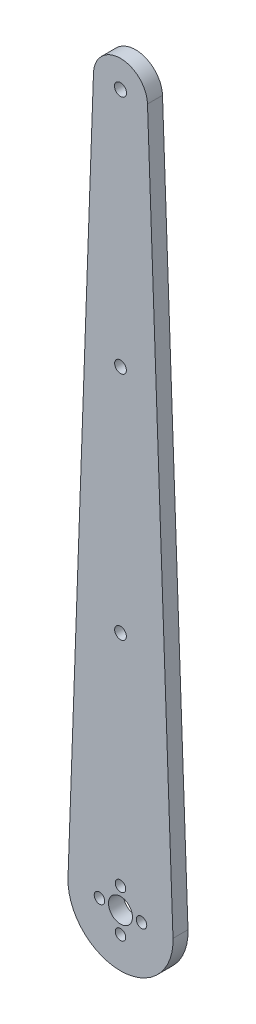
ISO-10303-21;
HEADER;
FILE_DESCRIPTION(('STEP AP214'),'2;1');
FILE_NAME('part.step','',(''),(''),'','','');
FILE_SCHEMA(('AUTOMOTIVE_DESIGN { 1 0 10303 214 1 1 1 1 }'));
ENDSEC;
DATA;
#1=APPLICATION_CONTEXT('core data for automotive mechanical design processes');
#2=APPLICATION_PROTOCOL_DEFINITION('international standard','automotive_design',2000,#1);
#3=PRODUCT_CONTEXT('',#1,'mechanical');
#4=PRODUCT('Part','Part','',(#3));
#5=PRODUCT_RELATED_PRODUCT_CATEGORY('part','',(#4));
#6=PRODUCT_DEFINITION_FORMATION('','',#4);
#7=PRODUCT_DEFINITION_CONTEXT('part definition',#1,'design');
#8=PRODUCT_DEFINITION('design','',#6,#7);
#9=PRODUCT_DEFINITION_SHAPE('','',#8);
#10=(LENGTH_UNIT() NAMED_UNIT(*) SI_UNIT(.MILLI.,.METRE.));
#11=(NAMED_UNIT(*) PLANE_ANGLE_UNIT() SI_UNIT($,.RADIAN.));
#12=(NAMED_UNIT(*) SI_UNIT($,.STERADIAN.) SOLID_ANGLE_UNIT());
#13=UNCERTAINTY_MEASURE_WITH_UNIT(LENGTH_MEASURE(1.E-05),#10,'distance_accuracy_value','');
#14=(GEOMETRIC_REPRESENTATION_CONTEXT(3) GLOBAL_UNCERTAINTY_ASSIGNED_CONTEXT((#13)) GLOBAL_UNIT_ASSIGNED_CONTEXT((#10,
#11,#12)) REPRESENTATION_CONTEXT('',''));
#15=CARTESIAN_POINT('',(0.,0.,0.));
#16=DIRECTION('',(0.,0.,1.));
#17=DIRECTION('',(1.,0.,0.));
#18=AXIS2_PLACEMENT_3D('',#15,#16,#17);
#19=CARTESIAN_POINT('',(0.,236.8,-5.));
#20=DIRECTION('',(0.,0.,1.));
#21=DIRECTION('',(1.,0.,0.));
#22=AXIS2_PLACEMENT_3D('',#19,#20,#21);
#23=CYLINDRICAL_SURFACE('',#22,9.00000000000001);
#24=CARTESIAN_POINT('',(0.,236.8,0.));
#25=DIRECTION('',(0.,0.,1.));
#26=DIRECTION('',(1.,0.,0.));
#27=AXIS2_PLACEMENT_3D('',#24,#25,#26);
#28=CIRCLE('',#27,9.00000000000001);
#29=CARTESIAN_POINT('',(8.99420001419527,237.123057432432,0.));
#30=VERTEX_POINT('',#29);
#31=CARTESIAN_POINT('',(-8.99420001419527,237.123057432432,0.));
#32=VERTEX_POINT('',#31);
#33=EDGE_CURVE('E98',#30,#32,#28,.T.);
#34=ORIENTED_EDGE('',*,*,#33,.F.);
#35=DIRECTION('',(0.,0.,1.));
#36=VECTOR('',#35,1.);
#37=CARTESIAN_POINT('',(8.99420001419527,237.123057432432,-5.));
#38=LINE('',#37,#36);
#39=CARTESIAN_POINT('',(8.99420001419527,237.123057432432,-5.));
#40=VERTEX_POINT('',#39);
#41=EDGE_CURVE('E11',#40,#30,#38,.T.);
#42=ORIENTED_EDGE('',*,*,#41,.F.);
#43=CARTESIAN_POINT('',(0.,236.8,-5.));
#44=DIRECTION('',(0.,0.,1.));
#45=DIRECTION('',(1.,0.,0.));
#46=AXIS2_PLACEMENT_3D('',#43,#44,#45);
#47=CIRCLE('',#46,9.00000000000001);
#48=CARTESIAN_POINT('',(-8.99420001419527,237.123057432432,-5.));
#49=VERTEX_POINT('',#48);
#50=EDGE_CURVE('E91',#40,#49,#47,.T.);
#51=ORIENTED_EDGE('',*,*,#50,.T.);
#52=DIRECTION('',(0.,0.,1.));
#53=VECTOR('',#52,1.);
#54=CARTESIAN_POINT('',(-8.99420001419527,237.123057432432,-5.));
#55=LINE('',#54,#53);
#56=EDGE_CURVE('E36',#49,#32,#55,.T.);
#57=ORIENTED_EDGE('',*,*,#56,.T.);
#58=EDGE_LOOP('',(#34,#42,#51,#57));
#59=FACE_BOUND('',#58,.T.);
#60=ADVANCED_FACE('F33',(#59),#23,.T.);
#61=CARTESIAN_POINT('',(8.99420001419527,237.123057432432,-5.));
#62=DIRECTION('',(0.999355557132808,0.0358952702702703,0.));
#63=DIRECTION('',(-0.0358952702702703,0.999355557132808,0.));
#64=AXIS2_PLACEMENT_3D('',#61,#62,#63);
#65=PLANE('',#64);
#66=DIRECTION('',(-0.0358952702702703,0.999355557132807,0.));
#67=VECTOR('',#66,1.);
#68=CARTESIAN_POINT('',(8.99420001419527,237.123057432432,0.));
#69=LINE('',#68,#67);
#70=CARTESIAN_POINT('',(17.4887222498241,0.62816722972973,0.));
#71=VERTEX_POINT('',#70);
#72=EDGE_CURVE('E93',#71,#30,#69,.T.);
#73=ORIENTED_EDGE('',*,*,#72,.F.);
#74=DIRECTION('',(0.,0.,1.));
#75=VECTOR('',#74,1.);
#76=CARTESIAN_POINT('',(17.4887222498241,0.62816722972973,-5.));
#77=LINE('',#76,#75);
#78=CARTESIAN_POINT('',(17.4887222498241,0.62816722972973,-5.));
#79=VERTEX_POINT('',#78);
#80=EDGE_CURVE('E42',#79,#71,#77,.T.);
#81=ORIENTED_EDGE('',*,*,#80,.F.);
#82=DIRECTION('',(-0.0358952702702703,0.999355557132807,0.));
#83=VECTOR('',#82,1.);
#84=CARTESIAN_POINT('',(8.99420001419527,237.123057432432,-5.));
#85=LINE('',#84,#83);
#86=EDGE_CURVE('E88',#79,#40,#85,.T.);
#87=ORIENTED_EDGE('',*,*,#86,.T.);
#88=ORIENTED_EDGE('',*,*,#41,.T.);
#89=EDGE_LOOP('',(#73,#81,#87,#88));
#90=FACE_BOUND('',#89,.T.);
#91=ADVANCED_FACE('F109',(#90),#65,.T.);
#92=CARTESIAN_POINT('',(0.,0.,-5.));
#93=DIRECTION('',(0.,0.,1.));
#94=DIRECTION('',(1.,0.,0.));
#95=AXIS2_PLACEMENT_3D('',#92,#93,#94);
#96=CYLINDRICAL_SURFACE('',#95,17.5);
#97=CARTESIAN_POINT('',(0.,0.,0.));
#98=DIRECTION('',(0.,0.,1.));
#99=DIRECTION('',(1.,0.,0.));
#100=AXIS2_PLACEMENT_3D('',#97,#98,#99);
#101=CIRCLE('',#100,17.5);
#102=CARTESIAN_POINT('',(-17.4887222498241,0.628167229729727,0.));
#103=VERTEX_POINT('',#102);
#104=EDGE_CURVE('E83',#103,#71,#101,.T.);
#105=ORIENTED_EDGE('',*,*,#104,.F.);
#106=DIRECTION('',(0.,0.,1.));
#107=VECTOR('',#106,1.);
#108=CARTESIAN_POINT('',(-17.4887222498241,0.628167229729727,-5.));
#109=LINE('',#108,#107);
#110=CARTESIAN_POINT('',(-17.4887222498241,0.628167229729727,-5.));
#111=VERTEX_POINT('',#110);
#112=EDGE_CURVE('E78',#111,#103,#109,.T.);
#113=ORIENTED_EDGE('',*,*,#112,.F.);
#114=CARTESIAN_POINT('',(0.,0.,-5.));
#115=DIRECTION('',(0.,0.,1.));
#116=DIRECTION('',(1.,0.,0.));
#117=AXIS2_PLACEMENT_3D('',#114,#115,#116);
#118=CIRCLE('',#117,17.5);
#119=EDGE_CURVE('E81',#111,#79,#118,.T.);
#120=ORIENTED_EDGE('',*,*,#119,.T.);
#121=ORIENTED_EDGE('',*,*,#80,.T.);
#122=EDGE_LOOP('',(#105,#113,#120,#121));
#123=FACE_BOUND('',#122,.T.);
#124=ADVANCED_FACE('F80',(#123),#96,.T.);
#125=CARTESIAN_POINT('',(-8.99420001419527,237.123057432432,-5.));
#126=DIRECTION('',(-0.999355557132808,0.0358952702702703,0.));
#127=DIRECTION('',(-0.0358952702702703,-0.999355557132808,0.));
#128=AXIS2_PLACEMENT_3D('',#125,#126,#127);
#129=PLANE('',#128);
#130=DIRECTION('',(-0.0358952702702703,-0.999355557132807,0.));
#131=VECTOR('',#130,1.);
#132=CARTESIAN_POINT('',(-8.99420001419527,237.123057432432,0.));
#133=LINE('',#132,#131);
#134=EDGE_CURVE('E101',#32,#103,#133,.T.);
#135=ORIENTED_EDGE('',*,*,#134,.F.);
#136=ORIENTED_EDGE('',*,*,#56,.F.);
#137=DIRECTION('',(-0.0358952702702703,-0.999355557132807,0.));
#138=VECTOR('',#137,1.);
#139=CARTESIAN_POINT('',(-8.99420001419527,237.123057432432,-5.));
#140=LINE('',#139,#138);
#141=EDGE_CURVE('E87',#49,#111,#140,.T.);
#142=ORIENTED_EDGE('',*,*,#141,.T.);
#143=ORIENTED_EDGE('',*,*,#112,.T.);
#144=EDGE_LOOP('',(#135,#136,#142,#143));
#145=FACE_BOUND('',#144,.T.);
#146=ADVANCED_FACE('F90',(#145),#129,.T.);
#147=CARTESIAN_POINT('',(0.,236.8,-5.));
#148=DIRECTION('',(0.,0.,1.));
#149=DIRECTION('',(1.,0.,0.));
#150=AXIS2_PLACEMENT_3D('',#147,#148,#149);
#151=PLANE('',#150);
#152=CARTESIAN_POINT('',(7.,0.,-5.));
#153=DIRECTION('',(0.,0.,1.));
#154=DIRECTION('',(1.,0.,0.));
#155=AXIS2_PLACEMENT_3D('',#152,#153,#154);
#156=CIRCLE('',#155,1.75);
#157=CARTESIAN_POINT('',(8.75,0.,-5.));
#158=VERTEX_POINT('',#157);
#159=EDGE_CURVE('E169',#158,#158,#156,.T.);
#160=ORIENTED_EDGE('',*,*,#159,.T.);
#161=EDGE_LOOP('',(#160));
#162=FACE_BOUND('',#161,.T.);
#163=CARTESIAN_POINT('',(0.,7.,-5.));
#164=DIRECTION('',(0.,0.,1.));
#165=DIRECTION('',(1.,0.,0.));
#166=AXIS2_PLACEMENT_3D('',#163,#164,#165);
#167=CIRCLE('',#166,1.75);
#168=CARTESIAN_POINT('',(1.75,7.,-5.));
#169=VERTEX_POINT('',#168);
#170=EDGE_CURVE('E171',#169,#169,#167,.T.);
#171=ORIENTED_EDGE('',*,*,#170,.T.);
#172=EDGE_LOOP('',(#171));
#173=FACE_BOUND('',#172,.T.);
#174=CARTESIAN_POINT('',(0.,-7.,-5.));
#175=DIRECTION('',(0.,0.,1.));
#176=DIRECTION('',(1.,0.,0.));
#177=AXIS2_PLACEMENT_3D('',#174,#175,#176);
#178=CIRCLE('',#177,1.75);
#179=CARTESIAN_POINT('',(1.75,-7.,-5.));
#180=VERTEX_POINT('',#179);
#181=EDGE_CURVE('E177',#180,#180,#178,.T.);
#182=ORIENTED_EDGE('',*,*,#181,.T.);
#183=EDGE_LOOP('',(#182));
#184=FACE_BOUND('',#183,.T.);
#185=CARTESIAN_POINT('',(-7.,0.,-5.));
#186=DIRECTION('',(0.,0.,1.));
#187=DIRECTION('',(1.,0.,0.));
#188=AXIS2_PLACEMENT_3D('',#185,#186,#187);
#189=CIRCLE('',#188,1.75);
#190=CARTESIAN_POINT('',(-5.25,0.,-5.));
#191=VERTEX_POINT('',#190);
#192=EDGE_CURVE('E218',#191,#191,#189,.T.);
#193=ORIENTED_EDGE('',*,*,#192,.T.);
#194=EDGE_LOOP('',(#193));
#195=FACE_BOUND('',#194,.T.);
#196=CARTESIAN_POINT('',(0.,156.8,-5.));
#197=DIRECTION('',(0.,0.,1.));
#198=DIRECTION('',(1.,0.,0.));
#199=AXIS2_PLACEMENT_3D('',#196,#197,#198);
#200=CIRCLE('',#199,1.94999999999999);
#201=CARTESIAN_POINT('',(1.95,156.8,-5.));
#202=VERTEX_POINT('',#201);
#203=EDGE_CURVE('E174',#202,#202,#200,.T.);
#204=ORIENTED_EDGE('',*,*,#203,.T.);
#205=EDGE_LOOP('',(#204));
#206=FACE_BOUND('',#205,.T.);
#207=CARTESIAN_POINT('',(0.,80.,-5.));
#208=DIRECTION('',(0.,0.,1.));
#209=DIRECTION('',(1.,0.,0.));
#210=AXIS2_PLACEMENT_3D('',#207,#208,#209);
#211=CIRCLE('',#210,1.94999999999999);
#212=CARTESIAN_POINT('',(1.95000000000001,80.,-5.));
#213=VERTEX_POINT('',#212);
#214=EDGE_CURVE('E186',#213,#213,#211,.T.);
#215=ORIENTED_EDGE('',*,*,#214,.T.);
#216=EDGE_LOOP('',(#215));
#217=FACE_BOUND('',#216,.T.);
#218=CARTESIAN_POINT('',(0.,236.8,-5.));
#219=DIRECTION('',(0.,0.,1.));
#220=DIRECTION('',(1.,0.,0.));
#221=AXIS2_PLACEMENT_3D('',#218,#219,#220);
#222=CIRCLE('',#221,2.);
#223=CARTESIAN_POINT('',(2.,236.8,-5.));
#224=VERTEX_POINT('',#223);
#225=EDGE_CURVE('E190',#224,#224,#222,.T.);
#226=ORIENTED_EDGE('',*,*,#225,.T.);
#227=EDGE_LOOP('',(#226));
#228=FACE_BOUND('',#227,.T.);
#229=CARTESIAN_POINT('',(0.,0.,-5.));
#230=DIRECTION('',(0.,0.,1.));
#231=DIRECTION('',(1.,0.,0.));
#232=AXIS2_PLACEMENT_3D('',#229,#230,#231);
#233=CIRCLE('',#232,4.);
#234=CARTESIAN_POINT('',(4.,0.,-5.));
#235=VERTEX_POINT('',#234);
#236=EDGE_CURVE('E102',#235,#235,#233,.T.);
#237=ORIENTED_EDGE('',*,*,#236,.T.);
#238=EDGE_LOOP('',(#237));
#239=FACE_BOUND('',#238,.T.);
#240=ORIENTED_EDGE('',*,*,#50,.F.);
#241=ORIENTED_EDGE('',*,*,#86,.F.);
#242=ORIENTED_EDGE('',*,*,#119,.F.);
#243=ORIENTED_EDGE('',*,*,#141,.F.);
#244=EDGE_LOOP('',(#240,#241,#242,#243));
#245=FACE_BOUND('',#244,.T.);
#246=ADVANCED_FACE('F86',(#162,#173,#184,#195,#206,#217,#228,#239,#245),#151,.F.);
#247=CARTESIAN_POINT('',(0.,236.8,0.));
#248=DIRECTION('',(0.,0.,1.));
#249=DIRECTION('',(1.,0.,0.));
#250=AXIS2_PLACEMENT_3D('',#247,#248,#249);
#251=PLANE('',#250);
#252=CARTESIAN_POINT('',(7.,0.,0.));
#253=DIRECTION('',(0.,0.,1.));
#254=DIRECTION('',(1.,0.,0.));
#255=AXIS2_PLACEMENT_3D('',#252,#253,#254);
#256=CIRCLE('',#255,1.75);
#257=CARTESIAN_POINT('',(8.75,0.,0.));
#258=VERTEX_POINT('',#257);
#259=EDGE_CURVE('E167',#258,#258,#256,.T.);
#260=ORIENTED_EDGE('',*,*,#259,.F.);
#261=EDGE_LOOP('',(#260));
#262=FACE_BOUND('',#261,.T.);
#263=CARTESIAN_POINT('',(0.,7.,0.));
#264=DIRECTION('',(0.,0.,1.));
#265=DIRECTION('',(1.,0.,0.));
#266=AXIS2_PLACEMENT_3D('',#263,#264,#265);
#267=CIRCLE('',#266,1.75);
#268=CARTESIAN_POINT('',(1.75,7.,0.));
#269=VERTEX_POINT('',#268);
#270=EDGE_CURVE('E227',#269,#269,#267,.T.);
#271=ORIENTED_EDGE('',*,*,#270,.F.);
#272=EDGE_LOOP('',(#271));
#273=FACE_BOUND('',#272,.T.);
#274=CARTESIAN_POINT('',(0.,-7.,0.));
#275=DIRECTION('',(0.,0.,1.));
#276=DIRECTION('',(1.,0.,0.));
#277=AXIS2_PLACEMENT_3D('',#274,#275,#276);
#278=CIRCLE('',#277,1.75);
#279=CARTESIAN_POINT('',(1.75,-7.,0.));
#280=VERTEX_POINT('',#279);
#281=EDGE_CURVE('E224',#280,#280,#278,.T.);
#282=ORIENTED_EDGE('',*,*,#281,.F.);
#283=EDGE_LOOP('',(#282));
#284=FACE_BOUND('',#283,.T.);
#285=CARTESIAN_POINT('',(-7.,0.,0.));
#286=DIRECTION('',(0.,0.,1.));
#287=DIRECTION('',(1.,0.,0.));
#288=AXIS2_PLACEMENT_3D('',#285,#286,#287);
#289=CIRCLE('',#288,1.75);
#290=CARTESIAN_POINT('',(-5.25,0.,0.));
#291=VERTEX_POINT('',#290);
#292=EDGE_CURVE('E221',#291,#291,#289,.T.);
#293=ORIENTED_EDGE('',*,*,#292,.F.);
#294=EDGE_LOOP('',(#293));
#295=FACE_BOUND('',#294,.T.);
#296=CARTESIAN_POINT('',(0.,156.8,0.));
#297=DIRECTION('',(0.,0.,1.));
#298=DIRECTION('',(1.,0.,0.));
#299=AXIS2_PLACEMENT_3D('',#296,#297,#298);
#300=CIRCLE('',#299,1.94999999999999);
#301=CARTESIAN_POINT('',(1.95,156.8,0.));
#302=VERTEX_POINT('',#301);
#303=EDGE_CURVE('E170',#302,#302,#300,.T.);
#304=ORIENTED_EDGE('',*,*,#303,.F.);
#305=EDGE_LOOP('',(#304));
#306=FACE_BOUND('',#305,.T.);
#307=CARTESIAN_POINT('',(0.,80.,0.));
#308=DIRECTION('',(0.,0.,1.));
#309=DIRECTION('',(1.,0.,0.));
#310=AXIS2_PLACEMENT_3D('',#307,#308,#309);
#311=CIRCLE('',#310,1.94999999999999);
#312=CARTESIAN_POINT('',(1.95000000000001,80.,0.));
#313=VERTEX_POINT('',#312);
#314=EDGE_CURVE('E183',#313,#313,#311,.T.);
#315=ORIENTED_EDGE('',*,*,#314,.F.);
#316=EDGE_LOOP('',(#315));
#317=FACE_BOUND('',#316,.T.);
#318=CARTESIAN_POINT('',(0.,236.8,0.));
#319=DIRECTION('',(0.,0.,1.));
#320=DIRECTION('',(1.,0.,0.));
#321=AXIS2_PLACEMENT_3D('',#318,#319,#320);
#322=CIRCLE('',#321,2.);
#323=CARTESIAN_POINT('',(2.,236.8,0.));
#324=VERTEX_POINT('',#323);
#325=EDGE_CURVE('E189',#324,#324,#322,.T.);
#326=ORIENTED_EDGE('',*,*,#325,.F.);
#327=EDGE_LOOP('',(#326));
#328=FACE_BOUND('',#327,.T.);
#329=CARTESIAN_POINT('',(0.,0.,0.));
#330=DIRECTION('',(0.,0.,1.));
#331=DIRECTION('',(1.,0.,0.));
#332=AXIS2_PLACEMENT_3D('',#329,#330,#331);
#333=CIRCLE('',#332,4.);
#334=CARTESIAN_POINT('',(4.,0.,0.));
#335=VERTEX_POINT('',#334);
#336=EDGE_CURVE('E193',#335,#335,#333,.T.);
#337=ORIENTED_EDGE('',*,*,#336,.F.);
#338=EDGE_LOOP('',(#337));
#339=FACE_BOUND('',#338,.T.);
#340=ORIENTED_EDGE('',*,*,#33,.T.);
#341=ORIENTED_EDGE('',*,*,#134,.T.);
#342=ORIENTED_EDGE('',*,*,#104,.T.);
#343=ORIENTED_EDGE('',*,*,#72,.T.);
#344=EDGE_LOOP('',(#340,#341,#342,#343));
#345=FACE_BOUND('',#344,.T.);
#346=ADVANCED_FACE('F108',(#262,#273,#284,#295,#306,#317,#328,#339,#345),#251,.T.);
#347=CARTESIAN_POINT('',(0.,0.,-5.));
#348=DIRECTION('',(0.,0.,1.));
#349=DIRECTION('',(1.,0.,0.));
#350=AXIS2_PLACEMENT_3D('',#347,#348,#349);
#351=CYLINDRICAL_SURFACE('',#350,4.);
#352=ORIENTED_EDGE('',*,*,#236,.F.);
#353=EDGE_LOOP('',(#352));
#354=FACE_BOUND('',#353,.T.);
#355=ORIENTED_EDGE('',*,*,#336,.T.);
#356=EDGE_LOOP('',(#355));
#357=FACE_BOUND('',#356,.T.);
#358=ADVANCED_FACE('F127',(#354,#357),#351,.F.);
#359=CARTESIAN_POINT('',(0.,236.8,-5.));
#360=DIRECTION('',(0.,0.,1.));
#361=DIRECTION('',(1.,0.,0.));
#362=AXIS2_PLACEMENT_3D('',#359,#360,#361);
#363=CYLINDRICAL_SURFACE('',#362,2.);
#364=ORIENTED_EDGE('',*,*,#225,.F.);
#365=EDGE_LOOP('',(#364));
#366=FACE_BOUND('',#365,.T.);
#367=ORIENTED_EDGE('',*,*,#325,.T.);
#368=EDGE_LOOP('',(#367));
#369=FACE_BOUND('',#368,.T.);
#370=ADVANCED_FACE('F134',(#366,#369),#363,.F.);
#371=CARTESIAN_POINT('',(0.,80.,0.));
#372=DIRECTION('',(0.,0.,1.));
#373=DIRECTION('',(1.,0.,0.));
#374=AXIS2_PLACEMENT_3D('',#371,#372,#373);
#375=CYLINDRICAL_SURFACE('',#374,1.94999999999999);
#376=ORIENTED_EDGE('',*,*,#314,.T.);
#377=EDGE_LOOP('',(#376));
#378=FACE_BOUND('',#377,.T.);
#379=ORIENTED_EDGE('',*,*,#214,.F.);
#380=EDGE_LOOP('',(#379));
#381=FACE_BOUND('',#380,.T.);
#382=ADVANCED_FACE('F138',(#378,#381),#375,.F.);
#383=CARTESIAN_POINT('',(0.,156.8,0.));
#384=DIRECTION('',(0.,0.,1.));
#385=DIRECTION('',(1.,0.,0.));
#386=AXIS2_PLACEMENT_3D('',#383,#384,#385);
#387=CYLINDRICAL_SURFACE('',#386,1.94999999999999);
#388=ORIENTED_EDGE('',*,*,#303,.T.);
#389=EDGE_LOOP('',(#388));
#390=FACE_BOUND('',#389,.T.);
#391=ORIENTED_EDGE('',*,*,#203,.F.);
#392=EDGE_LOOP('',(#391));
#393=FACE_BOUND('',#392,.T.);
#394=ADVANCED_FACE('F142',(#390,#393),#387,.F.);
#395=CARTESIAN_POINT('',(-7.,0.,-10.));
#396=DIRECTION('',(0.,0.,1.));
#397=DIRECTION('',(1.,0.,0.));
#398=AXIS2_PLACEMENT_3D('',#395,#396,#397);
#399=CYLINDRICAL_SURFACE('',#398,1.75);
#400=ORIENTED_EDGE('',*,*,#292,.T.);
#401=EDGE_LOOP('',(#400));
#402=FACE_BOUND('',#401,.T.);
#403=ORIENTED_EDGE('',*,*,#192,.F.);
#404=EDGE_LOOP('',(#403));
#405=FACE_BOUND('',#404,.T.);
#406=ADVANCED_FACE('F146',(#402,#405),#399,.F.);
#407=CARTESIAN_POINT('',(0.,-7.,-10.));
#408=DIRECTION('',(0.,0.,1.));
#409=DIRECTION('',(1.,0.,0.));
#410=AXIS2_PLACEMENT_3D('',#407,#408,#409);
#411=CYLINDRICAL_SURFACE('',#410,1.75);
#412=ORIENTED_EDGE('',*,*,#281,.T.);
#413=EDGE_LOOP('',(#412));
#414=FACE_BOUND('',#413,.T.);
#415=ORIENTED_EDGE('',*,*,#181,.F.);
#416=EDGE_LOOP('',(#415));
#417=FACE_BOUND('',#416,.T.);
#418=ADVANCED_FACE('F150',(#414,#417),#411,.F.);
#419=CARTESIAN_POINT('',(0.,7.,-10.));
#420=DIRECTION('',(0.,0.,1.));
#421=DIRECTION('',(1.,0.,0.));
#422=AXIS2_PLACEMENT_3D('',#419,#420,#421);
#423=CYLINDRICAL_SURFACE('',#422,1.75);
#424=ORIENTED_EDGE('',*,*,#270,.T.);
#425=EDGE_LOOP('',(#424));
#426=FACE_BOUND('',#425,.T.);
#427=ORIENTED_EDGE('',*,*,#170,.F.);
#428=EDGE_LOOP('',(#427));
#429=FACE_BOUND('',#428,.T.);
#430=ADVANCED_FACE('F154',(#426,#429),#423,.F.);
#431=CARTESIAN_POINT('',(7.,0.,-10.));
#432=DIRECTION('',(0.,0.,1.));
#433=DIRECTION('',(1.,0.,0.));
#434=AXIS2_PLACEMENT_3D('',#431,#432,#433);
#435=CYLINDRICAL_SURFACE('',#434,1.75);
#436=ORIENTED_EDGE('',*,*,#259,.T.);
#437=EDGE_LOOP('',(#436));
#438=FACE_BOUND('',#437,.T.);
#439=ORIENTED_EDGE('',*,*,#159,.F.);
#440=EDGE_LOOP('',(#439));
#441=FACE_BOUND('',#440,.T.);
#442=ADVANCED_FACE('F158',(#438,#441),#435,.F.);
#443=CLOSED_SHELL('',(#60,#91,#124,#146,#246,#346,#358,#370,#382,#394,#406,#418,#430,#442));
#444=MANIFOLD_SOLID_BREP('B2',#443);
#445=ADVANCED_BREP_SHAPE_REPRESENTATION('',(#18,#444),#14);
#446=SHAPE_DEFINITION_REPRESENTATION(#9,#445);
ENDSEC;
END-ISO-10303-21;
